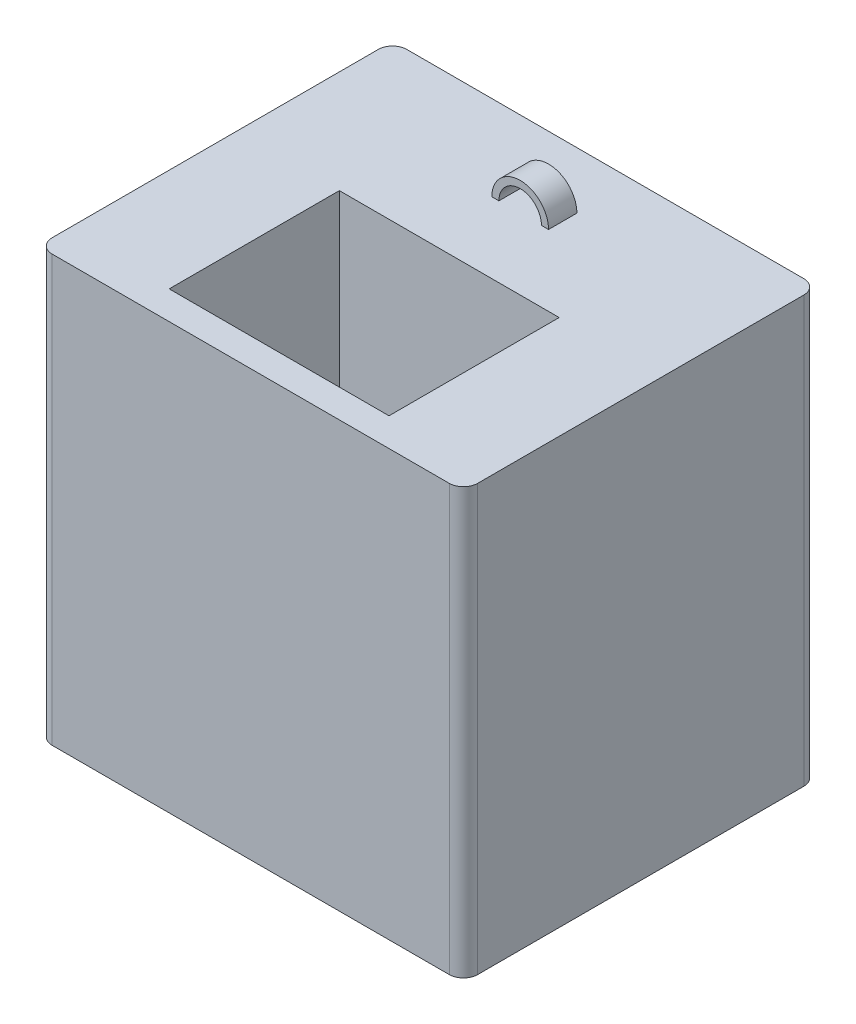
ISO-10303-21;
HEADER;
FILE_DESCRIPTION(('STEP AP214'),'2;1');
FILE_NAME('part.step','',(''),(''),'','','');
FILE_SCHEMA(('AUTOMOTIVE_DESIGN { 1 0 10303 214 1 1 1 1 }'));
ENDSEC;
DATA;
#1=APPLICATION_CONTEXT('core data for automotive mechanical design processes');
#2=APPLICATION_PROTOCOL_DEFINITION('international standard','automotive_design',2000,#1);
#3=PRODUCT_CONTEXT('',#1,'mechanical');
#4=PRODUCT('Part','Part','',(#3));
#5=PRODUCT_RELATED_PRODUCT_CATEGORY('part','',(#4));
#6=PRODUCT_DEFINITION_FORMATION('','',#4);
#7=PRODUCT_DEFINITION_CONTEXT('part definition',#1,'design');
#8=PRODUCT_DEFINITION('design','',#6,#7);
#9=PRODUCT_DEFINITION_SHAPE('','',#8);
#10=(LENGTH_UNIT() NAMED_UNIT(*) SI_UNIT(.MILLI.,.METRE.));
#11=(NAMED_UNIT(*) PLANE_ANGLE_UNIT() SI_UNIT($,.RADIAN.));
#12=(NAMED_UNIT(*) SI_UNIT($,.STERADIAN.) SOLID_ANGLE_UNIT());
#13=UNCERTAINTY_MEASURE_WITH_UNIT(LENGTH_MEASURE(1.E-05),#10,'distance_accuracy_value','');
#14=(GEOMETRIC_REPRESENTATION_CONTEXT(3) GLOBAL_UNCERTAINTY_ASSIGNED_CONTEXT((#13)) GLOBAL_UNIT_ASSIGNED_CONTEXT((#10,
#11,#12)) REPRESENTATION_CONTEXT('',''));
#15=CARTESIAN_POINT('',(0.,0.,0.));
#16=DIRECTION('',(0.,0.,1.));
#17=DIRECTION('',(1.,0.,0.));
#18=AXIS2_PLACEMENT_3D('',#15,#16,#17);
#19=CARTESIAN_POINT('',(15.,30.,-12.5));
#20=DIRECTION('',(-1.,0.,0.));
#21=DIRECTION('',(0.,0.,1.));
#22=AXIS2_PLACEMENT_3D('',#19,#20,#21);
#23=PLANE('',#22);
#24=DIRECTION('',(0.,0.,-1.));
#25=VECTOR('',#24,1.);
#26=CARTESIAN_POINT('',(15.,0.,-12.5));
#27=LINE('',#26,#25);
#28=CARTESIAN_POINT('',(15.,0.,11.5));
#29=VERTEX_POINT('',#28);
#30=CARTESIAN_POINT('',(15.,0.,-11.5));
#31=VERTEX_POINT('',#30);
#32=EDGE_CURVE('E212',#29,#31,#27,.T.);
#33=ORIENTED_EDGE('',*,*,#32,.T.);
#34=DIRECTION('',(0.,-1.,0.));
#35=VECTOR('',#34,1.);
#36=CARTESIAN_POINT('',(15.,30.,-11.5));
#37=LINE('',#36,#35);
#38=CARTESIAN_POINT('',(15.,30.,-11.5));
#39=VERTEX_POINT('',#38);
#40=EDGE_CURVE('E11',#31,#39,#37,.F.);
#41=ORIENTED_EDGE('',*,*,#40,.T.);
#42=DIRECTION('',(0.,0.,-1.));
#43=VECTOR('',#42,1.);
#44=CARTESIAN_POINT('',(15.,30.,-12.5));
#45=LINE('',#44,#43);
#46=CARTESIAN_POINT('',(15.,30.,11.5));
#47=VERTEX_POINT('',#46);
#48=EDGE_CURVE('E219',#47,#39,#45,.T.);
#49=ORIENTED_EDGE('',*,*,#48,.F.);
#50=DIRECTION('',(0.,-1.,0.));
#51=VECTOR('',#50,1.);
#52=CARTESIAN_POINT('',(15.,30.,11.5));
#53=LINE('',#52,#51);
#54=EDGE_CURVE('E49',#47,#29,#53,.T.);
#55=ORIENTED_EDGE('',*,*,#54,.T.);
#56=EDGE_LOOP('',(#33,#41,#49,#55));
#57=FACE_BOUND('',#56,.T.);
#58=ADVANCED_FACE('F41',(#57),#23,.F.);
#59=CARTESIAN_POINT('',(-15.,30.,-12.5));
#60=DIRECTION('',(0.,0.,1.));
#61=DIRECTION('',(1.,0.,0.));
#62=AXIS2_PLACEMENT_3D('',#59,#60,#61);
#63=PLANE('',#62);
#64=DIRECTION('',(-1.,0.,0.));
#65=VECTOR('',#64,1.);
#66=CARTESIAN_POINT('',(-15.,0.,-12.5));
#67=LINE('',#66,#65);
#68=CARTESIAN_POINT('',(14.,0.,-12.5));
#69=VERTEX_POINT('',#68);
#70=CARTESIAN_POINT('',(-14.,0.,-12.5));
#71=VERTEX_POINT('',#70);
#72=EDGE_CURVE('E235',#69,#71,#67,.T.);
#73=ORIENTED_EDGE('',*,*,#72,.T.);
#74=DIRECTION('',(0.,-1.,0.));
#75=VECTOR('',#74,1.);
#76=CARTESIAN_POINT('',(-14.,30.,-12.5));
#77=LINE('',#76,#75);
#78=CARTESIAN_POINT('',(-14.,30.,-12.5));
#79=VERTEX_POINT('',#78);
#80=EDGE_CURVE('E258',#71,#79,#77,.F.);
#81=ORIENTED_EDGE('',*,*,#80,.T.);
#82=DIRECTION('',(-1.,0.,0.));
#83=VECTOR('',#82,1.);
#84=CARTESIAN_POINT('',(-15.,30.,-12.5));
#85=LINE('',#84,#83);
#86=CARTESIAN_POINT('',(14.,30.,-12.5));
#87=VERTEX_POINT('',#86);
#88=EDGE_CURVE('E222',#87,#79,#85,.T.);
#89=ORIENTED_EDGE('',*,*,#88,.F.);
#90=DIRECTION('',(0.,-1.,0.));
#91=VECTOR('',#90,1.);
#92=CARTESIAN_POINT('',(14.,30.,-12.5));
#93=LINE('',#92,#91);
#94=EDGE_CURVE('E255',#87,#69,#93,.T.);
#95=ORIENTED_EDGE('',*,*,#94,.T.);
#96=EDGE_LOOP('',(#73,#81,#89,#95));
#97=FACE_BOUND('',#96,.T.);
#98=ADVANCED_FACE('F291',(#97),#63,.F.);
#99=CARTESIAN_POINT('',(-15.,30.,-12.5));
#100=DIRECTION('',(1.,0.,0.));
#101=DIRECTION('',(0.,0.,-1.));
#102=AXIS2_PLACEMENT_3D('',#99,#100,#101);
#103=PLANE('',#102);
#104=DIRECTION('',(0.,0.,1.));
#105=VECTOR('',#104,1.);
#106=CARTESIAN_POINT('',(-15.,30.,-12.5));
#107=LINE('',#106,#105);
#108=CARTESIAN_POINT('',(-15.,30.,-11.5));
#109=VERTEX_POINT('',#108);
#110=CARTESIAN_POINT('',(-15.,30.,11.5));
#111=VERTEX_POINT('',#110);
#112=EDGE_CURVE('E226',#109,#111,#107,.T.);
#113=ORIENTED_EDGE('',*,*,#112,.F.);
#114=DIRECTION('',(0.,-1.,0.));
#115=VECTOR('',#114,1.);
#116=CARTESIAN_POINT('',(-15.,30.,-11.5));
#117=LINE('',#116,#115);
#118=CARTESIAN_POINT('',(-15.,0.,-11.5));
#119=VERTEX_POINT('',#118);
#120=EDGE_CURVE('E244',#109,#119,#117,.T.);
#121=ORIENTED_EDGE('',*,*,#120,.T.);
#122=DIRECTION('',(0.,0.,1.));
#123=VECTOR('',#122,1.);
#124=CARTESIAN_POINT('',(-15.,0.,-12.5));
#125=LINE('',#124,#123);
#126=CARTESIAN_POINT('',(-15.,0.,11.5));
#127=VERTEX_POINT('',#126);
#128=EDGE_CURVE('E238',#119,#127,#125,.T.);
#129=ORIENTED_EDGE('',*,*,#128,.T.);
#130=DIRECTION('',(0.,-1.,0.));
#131=VECTOR('',#130,1.);
#132=CARTESIAN_POINT('',(-15.,30.,11.5));
#133=LINE('',#132,#131);
#134=EDGE_CURVE('E232',#127,#111,#133,.F.);
#135=ORIENTED_EDGE('',*,*,#134,.T.);
#136=EDGE_LOOP('',(#113,#121,#129,#135));
#137=FACE_BOUND('',#136,.T.);
#138=ADVANCED_FACE('F300',(#137),#103,.F.);
#139=CARTESIAN_POINT('',(-15.,30.,12.5));
#140=DIRECTION('',(0.,0.,-1.));
#141=DIRECTION('',(-1.,0.,0.));
#142=AXIS2_PLACEMENT_3D('',#139,#140,#141);
#143=PLANE('',#142);
#144=DIRECTION('',(1.,0.,0.));
#145=VECTOR('',#144,1.);
#146=CARTESIAN_POINT('',(-15.,30.,12.5));
#147=LINE('',#146,#145);
#148=CARTESIAN_POINT('',(-14.,30.,12.5));
#149=VERTEX_POINT('',#148);
#150=CARTESIAN_POINT('',(14.,30.,12.5));
#151=VERTEX_POINT('',#150);
#152=EDGE_CURVE('E229',#149,#151,#147,.T.);
#153=ORIENTED_EDGE('',*,*,#152,.F.);
#154=DIRECTION('',(0.,-1.,0.));
#155=VECTOR('',#154,1.);
#156=CARTESIAN_POINT('',(-14.,30.,12.5));
#157=LINE('',#156,#155);
#158=CARTESIAN_POINT('',(-14.,0.,12.5));
#159=VERTEX_POINT('',#158);
#160=EDGE_CURVE('E270',#149,#159,#157,.T.);
#161=ORIENTED_EDGE('',*,*,#160,.T.);
#162=DIRECTION('',(1.,0.,0.));
#163=VECTOR('',#162,1.);
#164=CARTESIAN_POINT('',(-15.,0.,12.5));
#165=LINE('',#164,#163);
#166=CARTESIAN_POINT('',(14.,0.,12.5));
#167=VERTEX_POINT('',#166);
#168=EDGE_CURVE('E223',#159,#167,#165,.T.);
#169=ORIENTED_EDGE('',*,*,#168,.T.);
#170=DIRECTION('',(0.,-1.,0.));
#171=VECTOR('',#170,1.);
#172=CARTESIAN_POINT('',(14.,30.,12.5));
#173=LINE('',#172,#171);
#174=EDGE_CURVE('E268',#167,#151,#173,.F.);
#175=ORIENTED_EDGE('',*,*,#174,.T.);
#176=EDGE_LOOP('',(#153,#161,#169,#175));
#177=FACE_BOUND('',#176,.T.);
#178=ADVANCED_FACE('F308',(#177),#143,.F.);
#179=CARTESIAN_POINT('',(0.,30.,0.));
#180=DIRECTION('',(0.,1.,0.));
#181=DIRECTION('',(0.,0.,1.));
#182=AXIS2_PLACEMENT_3D('',#179,#180,#181);
#183=PLANE('',#182);
#184=DIRECTION('',(-1.,0.,0.));
#185=VECTOR('',#184,1.);
#186=CARTESIAN_POINT('',(0.,30.,-8.5));
#187=LINE('',#186,#185);
#188=CARTESIAN_POINT('',(2.00000000000001,30.,-8.5));
#189=VERTEX_POINT('',#188);
#190=CARTESIAN_POINT('',(1.50000000000001,30.,-8.5));
#191=VERTEX_POINT('',#190);
#192=EDGE_CURVE('E168',#189,#191,#187,.T.);
#193=ORIENTED_EDGE('',*,*,#192,.F.);
#194=DIRECTION('',(0.,0.,1.));
#195=VECTOR('',#194,1.);
#196=CARTESIAN_POINT('',(2.00000000000001,30.,-8.5));
#197=LINE('',#196,#195);
#198=CARTESIAN_POINT('',(2.00000000000001,30.,-6.5));
#199=VERTEX_POINT('',#198);
#200=EDGE_CURVE('E178',#189,#199,#197,.T.);
#201=ORIENTED_EDGE('',*,*,#200,.T.);
#202=DIRECTION('',(-1.,0.,0.));
#203=VECTOR('',#202,1.);
#204=CARTESIAN_POINT('',(0.,30.,-6.5));
#205=LINE('',#204,#203);
#206=CARTESIAN_POINT('',(1.50000000000001,30.,-6.5));
#207=VERTEX_POINT('',#206);
#208=EDGE_CURVE('E169',#199,#207,#205,.T.);
#209=ORIENTED_EDGE('',*,*,#208,.T.);
#210=DIRECTION('',(0.,0.,1.));
#211=VECTOR('',#210,1.);
#212=CARTESIAN_POINT('',(1.50000000000001,30.,-8.5));
#213=LINE('',#212,#211);
#214=EDGE_CURVE('E177',#191,#207,#213,.T.);
#215=ORIENTED_EDGE('',*,*,#214,.F.);
#216=EDGE_LOOP('',(#193,#201,#209,#215));
#217=FACE_BOUND('',#216,.T.);
#218=CARTESIAN_POINT('',(-1.49999999999999,30.,-8.5));
#219=VERTEX_POINT('',#218);
#220=CARTESIAN_POINT('',(-2.,30.,-8.5));
#221=VERTEX_POINT('',#220);
#222=EDGE_CURVE('E165',#219,#221,#187,.T.);
#223=ORIENTED_EDGE('',*,*,#222,.F.);
#224=DIRECTION('',(0.,0.,1.));
#225=VECTOR('',#224,1.);
#226=CARTESIAN_POINT('',(-1.49999999999999,30.,-8.5));
#227=LINE('',#226,#225);
#228=CARTESIAN_POINT('',(-1.49999999999999,30.,-6.5));
#229=VERTEX_POINT('',#228);
#230=EDGE_CURVE('E152',#219,#229,#227,.T.);
#231=ORIENTED_EDGE('',*,*,#230,.T.);
#232=CARTESIAN_POINT('',(-2.,30.,-6.5));
#233=VERTEX_POINT('',#232);
#234=EDGE_CURVE('E474',#229,#233,#205,.T.);
#235=ORIENTED_EDGE('',*,*,#234,.T.);
#236=DIRECTION('',(0.,0.,1.));
#237=VECTOR('',#236,1.);
#238=CARTESIAN_POINT('',(-2.,30.,-8.5));
#239=LINE('',#238,#237);
#240=EDGE_CURVE('E161',#221,#233,#239,.T.);
#241=ORIENTED_EDGE('',*,*,#240,.F.);
#242=EDGE_LOOP('',(#223,#231,#235,#241));
#243=FACE_BOUND('',#242,.T.);
#244=DIRECTION('',(0.,0.,-1.));
#245=VECTOR('',#244,1.);
#246=CARTESIAN_POINT('',(7.75000000000001,30.,-1.5));
#247=LINE('',#246,#245);
#248=CARTESIAN_POINT('',(7.75000000000001,30.,10.5));
#249=VERTEX_POINT('',#248);
#250=CARTESIAN_POINT('',(7.75000000000001,30.,-1.5));
#251=VERTEX_POINT('',#250);
#252=EDGE_CURVE('E160',#249,#251,#247,.T.);
#253=ORIENTED_EDGE('',*,*,#252,.F.);
#254=DIRECTION('',(1.,0.,0.));
#255=VECTOR('',#254,1.);
#256=CARTESIAN_POINT('',(-7.74999999999999,30.,10.5));
#257=LINE('',#256,#255);
#258=CARTESIAN_POINT('',(-7.74999999999999,30.,10.5));
#259=VERTEX_POINT('',#258);
#260=EDGE_CURVE('E191',#259,#249,#257,.T.);
#261=ORIENTED_EDGE('',*,*,#260,.F.);
#262=DIRECTION('',(0.,0.,1.));
#263=VECTOR('',#262,1.);
#264=CARTESIAN_POINT('',(-7.74999999999999,30.,-1.5));
#265=LINE('',#264,#263);
#266=CARTESIAN_POINT('',(-7.74999999999999,30.,-1.5));
#267=VERTEX_POINT('',#266);
#268=EDGE_CURVE('E205',#267,#259,#265,.T.);
#269=ORIENTED_EDGE('',*,*,#268,.F.);
#270=DIRECTION('',(-1.,0.,0.));
#271=VECTOR('',#270,1.);
#272=CARTESIAN_POINT('',(-7.74999999999999,30.,-1.5));
#273=LINE('',#272,#271);
#274=EDGE_CURVE('E202',#251,#267,#273,.T.);
#275=ORIENTED_EDGE('',*,*,#274,.F.);
#276=EDGE_LOOP('',(#253,#261,#269,#275));
#277=FACE_BOUND('',#276,.T.);
#278=ORIENTED_EDGE('',*,*,#88,.T.);
#279=CARTESIAN_POINT('',(-14.,30.,-11.5));
#280=DIRECTION('',(0.,1.,0.));
#281=DIRECTION('',(0.,0.,1.));
#282=AXIS2_PLACEMENT_3D('',#279,#280,#281);
#283=CIRCLE('',#282,1.);
#284=EDGE_CURVE('E266',#79,#109,#283,.T.);
#285=ORIENTED_EDGE('',*,*,#284,.T.);
#286=ORIENTED_EDGE('',*,*,#112,.T.);
#287=CARTESIAN_POINT('',(-14.,30.,11.5));
#288=DIRECTION('',(0.,1.,0.));
#289=DIRECTION('',(0.,0.,1.));
#290=AXIS2_PLACEMENT_3D('',#287,#288,#289);
#291=CIRCLE('',#290,1.);
#292=EDGE_CURVE('E264',#111,#149,#291,.T.);
#293=ORIENTED_EDGE('',*,*,#292,.T.);
#294=ORIENTED_EDGE('',*,*,#152,.T.);
#295=CARTESIAN_POINT('',(14.,30.,11.5));
#296=DIRECTION('',(0.,1.,0.));
#297=DIRECTION('',(0.,0.,1.));
#298=AXIS2_PLACEMENT_3D('',#295,#296,#297);
#299=CIRCLE('',#298,1.);
#300=EDGE_CURVE('E260',#151,#47,#299,.T.);
#301=ORIENTED_EDGE('',*,*,#300,.T.);
#302=ORIENTED_EDGE('',*,*,#48,.T.);
#303=CARTESIAN_POINT('',(14.,30.,-11.5));
#304=DIRECTION('',(0.,1.,0.));
#305=DIRECTION('',(0.,0.,1.));
#306=AXIS2_PLACEMENT_3D('',#303,#304,#305);
#307=CIRCLE('',#306,1.);
#308=EDGE_CURVE('E262',#39,#87,#307,.T.);
#309=ORIENTED_EDGE('',*,*,#308,.T.);
#310=EDGE_LOOP('',(#278,#285,#286,#293,#294,#301,#302,#309));
#311=FACE_BOUND('',#310,.T.);
#312=ADVANCED_FACE('F172',(#217,#243,#277,#311),#183,.T.);
#313=CARTESIAN_POINT('',(0.,0.,0.));
#314=DIRECTION('',(0.,1.,0.));
#315=DIRECTION('',(0.,0.,1.));
#316=AXIS2_PLACEMENT_3D('',#313,#314,#315);
#317=PLANE('',#316);
#318=DIRECTION('',(1.,0.,0.));
#319=VECTOR('',#318,1.);
#320=CARTESIAN_POINT('',(-7.74999999999999,0.,10.5));
#321=LINE('',#320,#319);
#322=CARTESIAN_POINT('',(-7.74999999999999,0.,10.5));
#323=VERTEX_POINT('',#322);
#324=CARTESIAN_POINT('',(7.75000000000001,0.,10.5));
#325=VERTEX_POINT('',#324);
#326=EDGE_CURVE('E197',#323,#325,#321,.T.);
#327=ORIENTED_EDGE('',*,*,#326,.T.);
#328=DIRECTION('',(0.,0.,-1.));
#329=VECTOR('',#328,1.);
#330=CARTESIAN_POINT('',(7.75000000000001,0.,-1.5));
#331=LINE('',#330,#329);
#332=CARTESIAN_POINT('',(7.75000000000001,0.,-1.5));
#333=VERTEX_POINT('',#332);
#334=EDGE_CURVE('E187',#325,#333,#331,.T.);
#335=ORIENTED_EDGE('',*,*,#334,.T.);
#336=DIRECTION('',(-1.,0.,0.));
#337=VECTOR('',#336,1.);
#338=CARTESIAN_POINT('',(-7.74999999999999,0.,-1.5));
#339=LINE('',#338,#337);
#340=CARTESIAN_POINT('',(-7.74999999999999,0.,-1.5));
#341=VERTEX_POINT('',#340);
#342=EDGE_CURVE('E190',#333,#341,#339,.T.);
#343=ORIENTED_EDGE('',*,*,#342,.T.);
#344=DIRECTION('',(0.,0.,1.));
#345=VECTOR('',#344,1.);
#346=CARTESIAN_POINT('',(-7.74999999999999,0.,-1.5));
#347=LINE('',#346,#345);
#348=EDGE_CURVE('E194',#341,#323,#347,.T.);
#349=ORIENTED_EDGE('',*,*,#348,.T.);
#350=EDGE_LOOP('',(#327,#335,#343,#349));
#351=FACE_BOUND('',#350,.T.);
#352=ORIENTED_EDGE('',*,*,#128,.F.);
#353=CARTESIAN_POINT('',(-14.,0.,-11.5));
#354=DIRECTION('',(0.,1.,0.));
#355=DIRECTION('',(0.,0.,1.));
#356=AXIS2_PLACEMENT_3D('',#353,#354,#355);
#357=CIRCLE('',#356,1.);
#358=EDGE_CURVE('E253',#119,#71,#357,.F.);
#359=ORIENTED_EDGE('',*,*,#358,.T.);
#360=ORIENTED_EDGE('',*,*,#72,.F.);
#361=CARTESIAN_POINT('',(14.,0.,-11.5));
#362=DIRECTION('',(0.,1.,0.));
#363=DIRECTION('',(0.,0.,1.));
#364=AXIS2_PLACEMENT_3D('',#361,#362,#363);
#365=CIRCLE('',#364,1.);
#366=EDGE_CURVE('E249',#69,#31,#365,.F.);
#367=ORIENTED_EDGE('',*,*,#366,.T.);
#368=ORIENTED_EDGE('',*,*,#32,.F.);
#369=CARTESIAN_POINT('',(14.,0.,11.5));
#370=DIRECTION('',(0.,1.,0.));
#371=DIRECTION('',(0.,0.,1.));
#372=AXIS2_PLACEMENT_3D('',#369,#370,#371);
#373=CIRCLE('',#372,1.);
#374=EDGE_CURVE('E247',#29,#167,#373,.F.);
#375=ORIENTED_EDGE('',*,*,#374,.T.);
#376=ORIENTED_EDGE('',*,*,#168,.F.);
#377=CARTESIAN_POINT('',(-14.,0.,11.5));
#378=DIRECTION('',(0.,1.,0.));
#379=DIRECTION('',(0.,0.,1.));
#380=AXIS2_PLACEMENT_3D('',#377,#378,#379);
#381=CIRCLE('',#380,1.);
#382=EDGE_CURVE('E251',#159,#127,#381,.F.);
#383=ORIENTED_EDGE('',*,*,#382,.T.);
#384=EDGE_LOOP('',(#352,#359,#360,#367,#368,#375,#376,#383));
#385=FACE_BOUND('',#384,.T.);
#386=ADVANCED_FACE('F282',(#351,#385),#317,.F.);
#387=CARTESIAN_POINT('',(7.75000000000001,0.,-1.5));
#388=DIRECTION('',(1.,0.,0.));
#389=DIRECTION('',(0.,0.,-1.));
#390=AXIS2_PLACEMENT_3D('',#387,#388,#389);
#391=PLANE('',#390);
#392=ORIENTED_EDGE('',*,*,#252,.T.);
#393=DIRECTION('',(0.,1.,0.));
#394=VECTOR('',#393,1.);
#395=CARTESIAN_POINT('',(7.75000000000001,0.,-1.5));
#396=LINE('',#395,#394);
#397=EDGE_CURVE('E200',#333,#251,#396,.T.);
#398=ORIENTED_EDGE('',*,*,#397,.F.);
#399=ORIENTED_EDGE('',*,*,#334,.F.);
#400=DIRECTION('',(0.,1.,0.));
#401=VECTOR('',#400,1.);
#402=CARTESIAN_POINT('',(7.75000000000001,0.,10.5));
#403=LINE('',#402,#401);
#404=EDGE_CURVE('E210',#325,#249,#403,.T.);
#405=ORIENTED_EDGE('',*,*,#404,.T.);
#406=EDGE_LOOP('',(#392,#398,#399,#405));
#407=FACE_BOUND('',#406,.T.);
#408=ADVANCED_FACE('F386',(#407),#391,.F.);
#409=CARTESIAN_POINT('',(-7.74999999999999,0.,10.5));
#410=DIRECTION('',(0.,0.,1.));
#411=DIRECTION('',(1.,0.,0.));
#412=AXIS2_PLACEMENT_3D('',#409,#410,#411);
#413=PLANE('',#412);
#414=ORIENTED_EDGE('',*,*,#260,.T.);
#415=ORIENTED_EDGE('',*,*,#404,.F.);
#416=ORIENTED_EDGE('',*,*,#326,.F.);
#417=DIRECTION('',(0.,1.,0.));
#418=VECTOR('',#417,1.);
#419=CARTESIAN_POINT('',(-7.74999999999999,0.,10.5));
#420=LINE('',#419,#418);
#421=EDGE_CURVE('E213',#323,#259,#420,.T.);
#422=ORIENTED_EDGE('',*,*,#421,.T.);
#423=EDGE_LOOP('',(#414,#415,#416,#422));
#424=FACE_BOUND('',#423,.T.);
#425=ADVANCED_FACE('F382',(#424),#413,.F.);
#426=CARTESIAN_POINT('',(-7.74999999999999,0.,-1.5));
#427=DIRECTION('',(-1.,0.,0.));
#428=DIRECTION('',(0.,0.,1.));
#429=AXIS2_PLACEMENT_3D('',#426,#427,#428);
#430=PLANE('',#429);
#431=ORIENTED_EDGE('',*,*,#268,.T.);
#432=ORIENTED_EDGE('',*,*,#421,.F.);
#433=ORIENTED_EDGE('',*,*,#348,.F.);
#434=DIRECTION('',(0.,1.,0.));
#435=VECTOR('',#434,1.);
#436=CARTESIAN_POINT('',(-7.74999999999999,0.,-1.5));
#437=LINE('',#436,#435);
#438=EDGE_CURVE('E215',#341,#267,#437,.T.);
#439=ORIENTED_EDGE('',*,*,#438,.T.);
#440=EDGE_LOOP('',(#431,#432,#433,#439));
#441=FACE_BOUND('',#440,.T.);
#442=ADVANCED_FACE('F385',(#441),#430,.F.);
#443=CARTESIAN_POINT('',(-7.74999999999999,0.,-1.5));
#444=DIRECTION('',(0.,0.,-1.));
#445=DIRECTION('',(-1.,0.,0.));
#446=AXIS2_PLACEMENT_3D('',#443,#444,#445);
#447=PLANE('',#446);
#448=ORIENTED_EDGE('',*,*,#274,.T.);
#449=ORIENTED_EDGE('',*,*,#438,.F.);
#450=ORIENTED_EDGE('',*,*,#342,.F.);
#451=ORIENTED_EDGE('',*,*,#397,.T.);
#452=EDGE_LOOP('',(#448,#449,#450,#451));
#453=FACE_BOUND('',#452,.T.);
#454=ADVANCED_FACE('F329',(#453),#447,.F.);
#455=CARTESIAN_POINT('',(-14.,30.,-11.5));
#456=DIRECTION('',(0.,-1.,0.));
#457=DIRECTION('',(0.,0.,-1.));
#458=AXIS2_PLACEMENT_3D('',#455,#456,#457);
#459=CYLINDRICAL_SURFACE('',#458,1.);
#460=ORIENTED_EDGE('',*,*,#284,.F.);
#461=ORIENTED_EDGE('',*,*,#80,.F.);
#462=ORIENTED_EDGE('',*,*,#358,.F.);
#463=ORIENTED_EDGE('',*,*,#120,.F.);
#464=EDGE_LOOP('',(#460,#461,#462,#463));
#465=FACE_BOUND('',#464,.T.);
#466=ADVANCED_FACE('F298',(#465),#459,.T.);
#467=CARTESIAN_POINT('',(-14.,30.,11.5));
#468=DIRECTION('',(0.,-1.,0.));
#469=DIRECTION('',(0.,0.,-1.));
#470=AXIS2_PLACEMENT_3D('',#467,#468,#469);
#471=CYLINDRICAL_SURFACE('',#470,1.);
#472=ORIENTED_EDGE('',*,*,#292,.F.);
#473=ORIENTED_EDGE('',*,*,#134,.F.);
#474=ORIENTED_EDGE('',*,*,#382,.F.);
#475=ORIENTED_EDGE('',*,*,#160,.F.);
#476=EDGE_LOOP('',(#472,#473,#474,#475));
#477=FACE_BOUND('',#476,.T.);
#478=ADVANCED_FACE('F305',(#477),#471,.T.);
#479=CARTESIAN_POINT('',(14.,30.,-11.5));
#480=DIRECTION('',(0.,-1.,0.));
#481=DIRECTION('',(0.,0.,-1.));
#482=AXIS2_PLACEMENT_3D('',#479,#480,#481);
#483=CYLINDRICAL_SURFACE('',#482,1.);
#484=ORIENTED_EDGE('',*,*,#308,.F.);
#485=ORIENTED_EDGE('',*,*,#40,.F.);
#486=ORIENTED_EDGE('',*,*,#366,.F.);
#487=ORIENTED_EDGE('',*,*,#94,.F.);
#488=EDGE_LOOP('',(#484,#485,#486,#487));
#489=FACE_BOUND('',#488,.T.);
#490=ADVANCED_FACE('F288',(#489),#483,.T.);
#491=CARTESIAN_POINT('',(14.,30.,11.5));
#492=DIRECTION('',(0.,-1.,0.));
#493=DIRECTION('',(0.,0.,-1.));
#494=AXIS2_PLACEMENT_3D('',#491,#492,#493);
#495=CYLINDRICAL_SURFACE('',#494,1.);
#496=ORIENTED_EDGE('',*,*,#300,.F.);
#497=ORIENTED_EDGE('',*,*,#174,.F.);
#498=ORIENTED_EDGE('',*,*,#374,.F.);
#499=ORIENTED_EDGE('',*,*,#54,.F.);
#500=EDGE_LOOP('',(#496,#497,#498,#499));
#501=FACE_BOUND('',#500,.T.);
#502=ADVANCED_FACE('F43',(#501),#495,.T.);
#503=CARTESIAN_POINT('',(0.,30.,-8.5));
#504=DIRECTION('',(0.,0.,1.));
#505=DIRECTION('',(1.,0.,0.));
#506=AXIS2_PLACEMENT_3D('',#503,#504,#505);
#507=CYLINDRICAL_SURFACE('',#506,1.5);
#508=CARTESIAN_POINT('',(0.,30.,-6.5));
#509=DIRECTION('',(0.,0.,-1.));
#510=DIRECTION('',(-1.,0.,0.));
#511=AXIS2_PLACEMENT_3D('',#508,#509,#510);
#512=CIRCLE('',#511,1.5);
#513=EDGE_CURVE('E56',#229,#207,#512,.T.);
#514=ORIENTED_EDGE('',*,*,#513,.F.);
#515=ORIENTED_EDGE('',*,*,#230,.F.);
#516=CARTESIAN_POINT('',(0.,30.,-8.5));
#517=DIRECTION('',(0.,0.,-1.));
#518=DIRECTION('',(-1.,0.,0.));
#519=AXIS2_PLACEMENT_3D('',#516,#517,#518);
#520=CIRCLE('',#519,1.5);
#521=EDGE_CURVE('E155',#219,#191,#520,.T.);
#522=ORIENTED_EDGE('',*,*,#521,.T.);
#523=ORIENTED_EDGE('',*,*,#214,.T.);
#524=EDGE_LOOP('',(#514,#515,#522,#523));
#525=FACE_BOUND('',#524,.T.);
#526=ADVANCED_FACE('F154',(#525),#507,.F.);
#527=CARTESIAN_POINT('',(0.,30.,-8.5));
#528=DIRECTION('',(0.,0.,1.));
#529=DIRECTION('',(1.,0.,0.));
#530=AXIS2_PLACEMENT_3D('',#527,#528,#529);
#531=CYLINDRICAL_SURFACE('',#530,2.);
#532=CARTESIAN_POINT('',(0.,30.,-6.5));
#533=DIRECTION('',(0.,0.,-1.));
#534=DIRECTION('',(-1.,0.,0.));
#535=AXIS2_PLACEMENT_3D('',#532,#533,#534);
#536=CIRCLE('',#535,2.);
#537=EDGE_CURVE('E61',#233,#199,#536,.T.);
#538=ORIENTED_EDGE('',*,*,#537,.T.);
#539=ORIENTED_EDGE('',*,*,#200,.F.);
#540=CARTESIAN_POINT('',(0.,30.,-8.5));
#541=DIRECTION('',(0.,0.,-1.));
#542=DIRECTION('',(-1.,0.,0.));
#543=AXIS2_PLACEMENT_3D('',#540,#541,#542);
#544=CIRCLE('',#543,2.);
#545=EDGE_CURVE('E174',#221,#189,#544,.T.);
#546=ORIENTED_EDGE('',*,*,#545,.F.);
#547=ORIENTED_EDGE('',*,*,#240,.T.);
#548=EDGE_LOOP('',(#538,#539,#546,#547));
#549=FACE_BOUND('',#548,.T.);
#550=ADVANCED_FACE('F316',(#549),#531,.T.);
#551=CARTESIAN_POINT('',(0.,0.,-8.5));
#552=DIRECTION('',(0.,0.,-1.));
#553=DIRECTION('',(-1.,0.,0.));
#554=AXIS2_PLACEMENT_3D('',#551,#552,#553);
#555=PLANE('',#554);
#556=ORIENTED_EDGE('',*,*,#521,.F.);
#557=ORIENTED_EDGE('',*,*,#222,.T.);
#558=ORIENTED_EDGE('',*,*,#545,.T.);
#559=ORIENTED_EDGE('',*,*,#192,.T.);
#560=EDGE_LOOP('',(#556,#557,#558,#559));
#561=FACE_BOUND('',#560,.T.);
#562=ADVANCED_FACE('F164',(#561),#555,.T.);
#563=CARTESIAN_POINT('',(0.,0.,-6.5));
#564=DIRECTION('',(0.,0.,-1.));
#565=DIRECTION('',(-1.,0.,0.));
#566=AXIS2_PLACEMENT_3D('',#563,#564,#565);
#567=PLANE('',#566);
#568=ORIENTED_EDGE('',*,*,#513,.T.);
#569=ORIENTED_EDGE('',*,*,#208,.F.);
#570=ORIENTED_EDGE('',*,*,#537,.F.);
#571=ORIENTED_EDGE('',*,*,#234,.F.);
#572=EDGE_LOOP('',(#568,#569,#570,#571));
#573=FACE_BOUND('',#572,.T.);
#574=ADVANCED_FACE('F370',(#573),#567,.F.);
#575=CLOSED_SHELL('',(#58,#98,#138,#178,#312,#386,#408,#425,#442,#454,#466,#478,#490,#502,#526,
#550,#562,#574));
#576=MANIFOLD_SOLID_BREP('B2',#575);
#577=ADVANCED_BREP_SHAPE_REPRESENTATION('',(#18,#576),#14);
#578=SHAPE_DEFINITION_REPRESENTATION(#9,#577);
ENDSEC;
END-ISO-10303-21;
